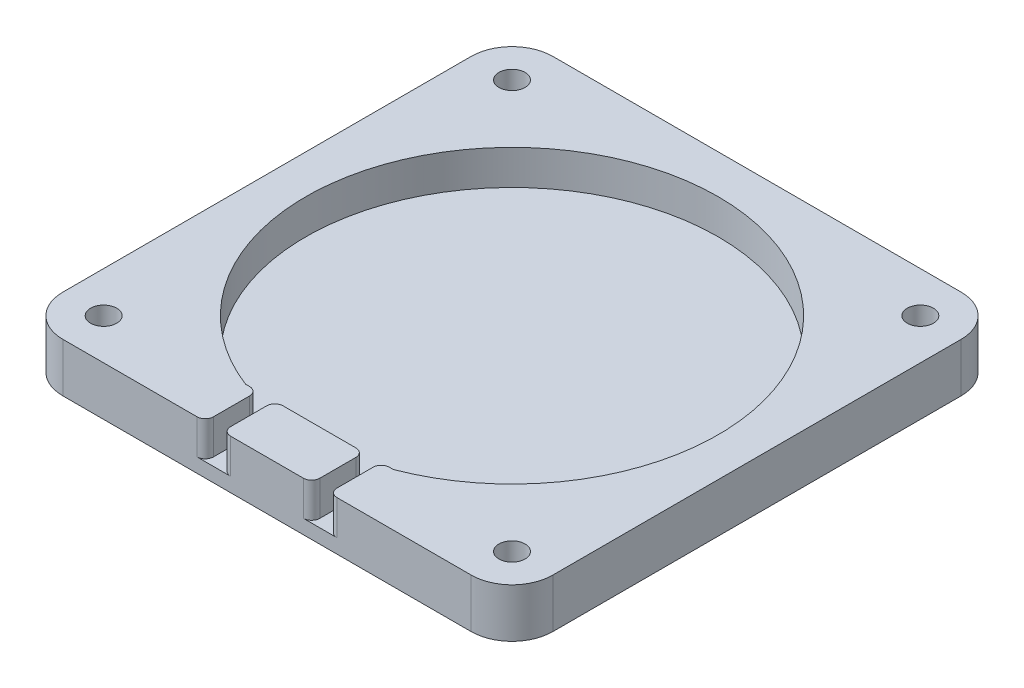
ISO-10303-21;
HEADER;
FILE_DESCRIPTION(('STEP AP214'),'2;1');
FILE_NAME('part.step','',(''),(''),'','','');
FILE_SCHEMA(('AUTOMOTIVE_DESIGN { 1 0 10303 214 1 1 1 1 }'));
ENDSEC;
DATA;
#1=APPLICATION_CONTEXT('core data for automotive mechanical design processes');
#2=APPLICATION_PROTOCOL_DEFINITION('international standard','automotive_design',2000,#1);
#3=PRODUCT_CONTEXT('',#1,'mechanical');
#4=PRODUCT('Part','Part','',(#3));
#5=PRODUCT_RELATED_PRODUCT_CATEGORY('part','',(#4));
#6=PRODUCT_DEFINITION_FORMATION('','',#4);
#7=PRODUCT_DEFINITION_CONTEXT('part definition',#1,'design');
#8=PRODUCT_DEFINITION('design','',#6,#7);
#9=PRODUCT_DEFINITION_SHAPE('','',#8);
#10=(LENGTH_UNIT() NAMED_UNIT(*) SI_UNIT(.MILLI.,.METRE.));
#11=(NAMED_UNIT(*) PLANE_ANGLE_UNIT() SI_UNIT($,.RADIAN.));
#12=(NAMED_UNIT(*) SI_UNIT($,.STERADIAN.) SOLID_ANGLE_UNIT());
#13=UNCERTAINTY_MEASURE_WITH_UNIT(LENGTH_MEASURE(1.E-05),#10,'distance_accuracy_value','');
#14=(GEOMETRIC_REPRESENTATION_CONTEXT(3) GLOBAL_UNCERTAINTY_ASSIGNED_CONTEXT((#13)) GLOBAL_UNIT_ASSIGNED_CONTEXT((#10,
#11,#12)) REPRESENTATION_CONTEXT('',''));
#15=CARTESIAN_POINT('',(0.,0.,0.));
#16=DIRECTION('',(0.,0.,1.));
#17=DIRECTION('',(1.,0.,0.));
#18=AXIS2_PLACEMENT_3D('',#15,#16,#17);
#19=CARTESIAN_POINT('',(0.,-1.74250000000005,0.));
#20=DIRECTION('',(0.,1.,0.));
#21=DIRECTION('',(0.,0.,1.));
#22=AXIS2_PLACEMENT_3D('',#19,#20,#21);
#23=PLANE('',#22);
#24=CARTESIAN_POINT('',(25.,-1.74250000000006,-25.));
#25=DIRECTION('',(0.,-1.,0.));
#26=DIRECTION('',(0.,0.,-1.));
#27=AXIS2_PLACEMENT_3D('',#24,#25,#26);
#28=CIRCLE('',#27,1.59999999999999);
#29=CARTESIAN_POINT('',(25.,-1.74250000000006,-26.6));
#30=VERTEX_POINT('',#29);
#31=EDGE_CURVE('E475',#30,#30,#28,.T.);
#32=ORIENTED_EDGE('',*,*,#31,.F.);
#33=EDGE_LOOP('',(#32));
#34=FACE_BOUND('',#33,.T.);
#35=CARTESIAN_POINT('',(-25.,-1.74250000000006,25.));
#36=DIRECTION('',(0.,-1.,0.));
#37=DIRECTION('',(0.,0.,-1.));
#38=AXIS2_PLACEMENT_3D('',#35,#36,#37);
#39=CIRCLE('',#38,1.59999999999999);
#40=CARTESIAN_POINT('',(-25.,-1.74250000000006,23.4));
#41=VERTEX_POINT('',#40);
#42=EDGE_CURVE('E463',#41,#41,#39,.T.);
#43=ORIENTED_EDGE('',*,*,#42,.F.);
#44=EDGE_LOOP('',(#43));
#45=FACE_BOUND('',#44,.T.);
#46=CARTESIAN_POINT('',(25.,-1.74250000000006,25.));
#47=DIRECTION('',(0.,-1.,0.));
#48=DIRECTION('',(0.,0.,-1.));
#49=AXIS2_PLACEMENT_3D('',#46,#47,#48);
#50=CIRCLE('',#49,1.59999999999999);
#51=CARTESIAN_POINT('',(25.,-1.74250000000006,23.4));
#52=VERTEX_POINT('',#51);
#53=EDGE_CURVE('E454',#52,#52,#50,.T.);
#54=ORIENTED_EDGE('',*,*,#53,.F.);
#55=EDGE_LOOP('',(#54));
#56=FACE_BOUND('',#55,.T.);
#57=DIRECTION('',(0.,0.,1.));
#58=VECTOR('',#57,1.);
#59=CARTESIAN_POINT('',(-30.,-1.74250000000026,30.0000000000006));
#60=LINE('',#59,#58);
#61=CARTESIAN_POINT('',(-30.,-1.74249999999987,-25.));
#62=VERTEX_POINT('',#61);
#63=CARTESIAN_POINT('',(-30.,-1.74250000000022,25.));
#64=VERTEX_POINT('',#63);
#65=EDGE_CURVE('E368',#62,#64,#60,.T.);
#66=ORIENTED_EDGE('',*,*,#65,.F.);
#67=CARTESIAN_POINT('',(-25.,-1.74249999999987,-25.));
#68=DIRECTION('',(0.,1.,0.));
#69=DIRECTION('',(0.,0.,1.));
#70=AXIS2_PLACEMENT_3D('',#67,#68,#69);
#71=CIRCLE('',#70,5.);
#72=CARTESIAN_POINT('',(-25.,-1.74249999999984,-30.));
#73=VERTEX_POINT('',#72);
#74=EDGE_CURVE('E332',#62,#73,#71,.F.);
#75=ORIENTED_EDGE('',*,*,#74,.T.);
#76=DIRECTION('',(-1.,0.,0.));
#77=VECTOR('',#76,1.);
#78=CARTESIAN_POINT('',(-30.,-1.74249999999984,-30.));
#79=LINE('',#78,#77);
#80=CARTESIAN_POINT('',(25.,-1.74249999999984,-30.));
#81=VERTEX_POINT('',#80);
#82=EDGE_CURVE('E363',#81,#73,#79,.T.);
#83=ORIENTED_EDGE('',*,*,#82,.F.);
#84=CARTESIAN_POINT('',(25.,-1.74249999999987,-25.));
#85=DIRECTION('',(0.,1.,0.));
#86=DIRECTION('',(0.,0.,1.));
#87=AXIS2_PLACEMENT_3D('',#84,#85,#86);
#88=CIRCLE('',#87,5.);
#89=CARTESIAN_POINT('',(30.,-1.74249999999988,-25.));
#90=VERTEX_POINT('',#89);
#91=EDGE_CURVE('E328',#81,#90,#88,.F.);
#92=ORIENTED_EDGE('',*,*,#91,.T.);
#93=DIRECTION('',(0.,0.,-1.));
#94=VECTOR('',#93,1.);
#95=CARTESIAN_POINT('',(30.,-1.74249999999984,-29.9999999999994));
#96=LINE('',#95,#94);
#97=CARTESIAN_POINT('',(30.,-1.74250000000023,25.));
#98=VERTEX_POINT('',#97);
#99=EDGE_CURVE('E354',#98,#90,#96,.T.);
#100=ORIENTED_EDGE('',*,*,#99,.F.);
#101=CARTESIAN_POINT('',(25.,-1.74250000000023,25.));
#102=DIRECTION('',(0.,1.,0.));
#103=DIRECTION('',(0.,0.,1.));
#104=AXIS2_PLACEMENT_3D('',#101,#102,#103);
#105=CIRCLE('',#104,5.);
#106=CARTESIAN_POINT('',(25.,-1.74250000000026,30.));
#107=VERTEX_POINT('',#106);
#108=EDGE_CURVE('E326',#98,#107,#105,.F.);
#109=ORIENTED_EDGE('',*,*,#108,.T.);
#110=DIRECTION('',(1.,0.,0.));
#111=VECTOR('',#110,1.);
#112=CARTESIAN_POINT('',(30.,-1.74250000000026,30.));
#113=LINE('',#112,#111);
#114=CARTESIAN_POINT('',(-25.,-1.74250000000026,30.));
#115=VERTEX_POINT('',#114);
#116=EDGE_CURVE('E364',#115,#107,#113,.T.);
#117=ORIENTED_EDGE('',*,*,#116,.F.);
#118=CARTESIAN_POINT('',(-25.,-1.74250000000023,25.));
#119=DIRECTION('',(0.,1.,0.));
#120=DIRECTION('',(0.,0.,1.));
#121=AXIS2_PLACEMENT_3D('',#118,#119,#120);
#122=CIRCLE('',#121,5.);
#123=EDGE_CURVE('E330',#115,#64,#122,.F.);
#124=ORIENTED_EDGE('',*,*,#123,.T.);
#125=EDGE_LOOP('',(#66,#75,#83,#92,#100,#109,#117,#124));
#126=FACE_BOUND('',#125,.T.);
#127=CARTESIAN_POINT('',(-25.,-1.74250000000006,-25.));
#128=DIRECTION('',(0.,-1.,0.));
#129=DIRECTION('',(0.,0.,-1.));
#130=AXIS2_PLACEMENT_3D('',#127,#128,#129);
#131=CIRCLE('',#130,1.59999999999999);
#132=CARTESIAN_POINT('',(-25.,-1.74250000000006,-26.6));
#133=VERTEX_POINT('',#132);
#134=EDGE_CURVE('E469',#133,#133,#131,.T.);
#135=ORIENTED_EDGE('',*,*,#134,.F.);
#136=EDGE_LOOP('',(#135));
#137=FACE_BOUND('',#136,.T.);
#138=ADVANCED_FACE('F42',(#34,#45,#56,#126,#137),#23,.F.);
#139=CARTESIAN_POINT('',(-9.0464410798009,89.1103137423856,23.5738075793812));
#140=DIRECTION('',(0.,0.,-1.));
#141=DIRECTION('',(-1.,0.,0.));
#142=AXIS2_PLACEMENT_3D('',#139,#140,#141);
#143=PLANE('',#142);
#144=DIRECTION('',(1.,0.,0.));
#145=VECTOR('',#144,1.);
#146=CARTESIAN_POINT('',(-9.0464410798009,4.25749999999978,23.5738075793812));
#147=LINE('',#146,#145);
#148=CARTESIAN_POINT('',(-4.46425651660579,4.25749999999978,23.5738075793812));
#149=VERTEX_POINT('',#148);
#150=CARTESIAN_POINT('',(4.46425651660579,4.25749999999978,23.5738075793812));
#151=VERTEX_POINT('',#150);
#152=EDGE_CURVE('E379',#149,#151,#147,.T.);
#153=ORIENTED_EDGE('',*,*,#152,.T.);
#154=DIRECTION('',(0.,1.,0.));
#155=VECTOR('',#154,1.);
#156=CARTESIAN_POINT('',(4.46425651660579,0.,23.5738075793812));
#157=LINE('',#156,#155);
#158=CARTESIAN_POINT('',(4.46425651660579,0.,23.5738075793812));
#159=VERTEX_POINT('',#158);
#160=EDGE_CURVE('E290',#151,#159,#157,.F.);
#161=ORIENTED_EDGE('',*,*,#160,.T.);
#162=DIRECTION('',(1.,0.,0.));
#163=VECTOR('',#162,1.);
#164=CARTESIAN_POINT('',(-9.0464410798009,0.,23.5738075793812));
#165=LINE('',#164,#163);
#166=CARTESIAN_POINT('',(-4.46425651660579,0.,23.5738075793812));
#167=VERTEX_POINT('',#166);
#168=EDGE_CURVE('E226',#167,#159,#165,.T.);
#169=ORIENTED_EDGE('',*,*,#168,.F.);
#170=DIRECTION('',(0.,-1.,0.));
#171=VECTOR('',#170,1.);
#172=CARTESIAN_POINT('',(-4.46425651660579,4.25749999999978,23.5738075793812));
#173=LINE('',#172,#171);
#174=EDGE_CURVE('E288',#167,#149,#173,.F.);
#175=ORIENTED_EDGE('',*,*,#174,.T.);
#176=EDGE_LOOP('',(#153,#161,#169,#175));
#177=FACE_BOUND('',#176,.T.);
#178=ADVANCED_FACE('F483',(#177),#143,.T.);
#179=CARTESIAN_POINT('',(-9.0464410798009,4.25749999999976,23.5738075793812));
#180=VERTEX_POINT('',#179);
#181=CARTESIAN_POINT('',(-8.55999999999981,4.25749999999978,23.5738075793812));
#182=VERTEX_POINT('',#181);
#183=EDGE_CURVE('E375',#180,#182,#147,.T.);
#184=ORIENTED_EDGE('',*,*,#183,.T.);
#185=DIRECTION('',(0.,1.,0.));
#186=VECTOR('',#185,1.);
#187=CARTESIAN_POINT('',(-8.55999999999981,0.,23.5738075793812));
#188=LINE('',#187,#186);
#189=CARTESIAN_POINT('',(-8.55999999999981,0.,23.5738075793812));
#190=VERTEX_POINT('',#189);
#191=EDGE_CURVE('E302',#182,#190,#188,.F.);
#192=ORIENTED_EDGE('',*,*,#191,.T.);
#193=CARTESIAN_POINT('',(-9.0464410798009,0.,23.5738075793812));
#194=VERTEX_POINT('',#193);
#195=EDGE_CURVE('E229',#194,#190,#165,.T.);
#196=ORIENTED_EDGE('',*,*,#195,.F.);
#197=DIRECTION('',(0.,-1.,0.));
#198=VECTOR('',#197,1.);
#199=CARTESIAN_POINT('',(-9.0464410798009,89.1103137423856,23.5738075793812));
#200=LINE('',#199,#198);
#201=EDGE_CURVE('E236',#180,#194,#200,.T.);
#202=ORIENTED_EDGE('',*,*,#201,.F.);
#203=EDGE_LOOP('',(#184,#192,#196,#202));
#204=FACE_BOUND('',#203,.T.);
#205=ADVANCED_FACE('F526',(#204),#143,.T.);
#206=CARTESIAN_POINT('',(0.,4.25749999999995,0.));
#207=DIRECTION('',(0.,1.,0.));
#208=DIRECTION('',(0.,0.,1.));
#209=AXIS2_PLACEMENT_3D('',#206,#207,#208);
#210=PLANE('',#209);
#211=DIRECTION('',(1.,0.,0.));
#212=VECTOR('',#211,1.);
#213=CARTESIAN_POINT('',(-30.,4.25749999999973,30.));
#214=LINE('',#213,#212);
#215=CARTESIAN_POINT('',(-4.46425651660579,4.25749999999973,30.));
#216=VERTEX_POINT('',#215);
#217=CARTESIAN_POINT('',(4.46425651660579,4.25749999999973,30.));
#218=VERTEX_POINT('',#217);
#219=EDGE_CURVE('E383',#216,#218,#214,.T.);
#220=ORIENTED_EDGE('',*,*,#219,.T.);
#221=CARTESIAN_POINT('',(4.46425651660579,4.25749999999973,29.));
#222=DIRECTION('',(0.,1.,0.));
#223=DIRECTION('',(0.,0.,1.));
#224=AXIS2_PLACEMENT_3D('',#221,#222,#223);
#225=CIRCLE('',#224,1.);
#226=CARTESIAN_POINT('',(5.46425651660579,4.25749999999974,29.));
#227=VERTEX_POINT('',#226);
#228=EDGE_CURVE('E279',#218,#227,#225,.T.);
#229=ORIENTED_EDGE('',*,*,#228,.T.);
#230=DIRECTION('',(0.,0.,1.));
#231=VECTOR('',#230,1.);
#232=CARTESIAN_POINT('',(5.46425651660579,4.25749999999962,46.4548250881965));
#233=LINE('',#232,#231);
#234=CARTESIAN_POINT('',(5.46425651660579,4.25749999999977,24.5738075793812));
#235=VERTEX_POINT('',#234);
#236=EDGE_CURVE('E405',#235,#227,#233,.T.);
#237=ORIENTED_EDGE('',*,*,#236,.F.);
#238=CARTESIAN_POINT('',(4.46425651660579,4.25749999999978,24.5738075793812));
#239=DIRECTION('',(0.,1.,0.));
#240=DIRECTION('',(0.,0.,1.));
#241=AXIS2_PLACEMENT_3D('',#238,#239,#240);
#242=CIRCLE('',#241,1.);
#243=EDGE_CURVE('E277',#235,#151,#242,.T.);
#244=ORIENTED_EDGE('',*,*,#243,.T.);
#245=ORIENTED_EDGE('',*,*,#152,.F.);
#246=CARTESIAN_POINT('',(-4.46425651660579,4.25749999999978,24.5738075793812));
#247=DIRECTION('',(0.,1.,0.));
#248=DIRECTION('',(0.,0.,1.));
#249=AXIS2_PLACEMENT_3D('',#246,#247,#248);
#250=CIRCLE('',#249,1.);
#251=CARTESIAN_POINT('',(-5.46425651660579,4.25749999999977,24.5738075793812));
#252=VERTEX_POINT('',#251);
#253=EDGE_CURVE('E275',#149,#252,#250,.T.);
#254=ORIENTED_EDGE('',*,*,#253,.T.);
#255=DIRECTION('',(0.,0.,-1.));
#256=VECTOR('',#255,1.);
#257=CARTESIAN_POINT('',(-5.46425651660579,4.25749999999962,46.4548250881965));
#258=LINE('',#257,#256);
#259=CARTESIAN_POINT('',(-5.46425651660579,4.25749999999974,29.));
#260=VERTEX_POINT('',#259);
#261=EDGE_CURVE('E443',#260,#252,#258,.T.);
#262=ORIENTED_EDGE('',*,*,#261,.F.);
#263=CARTESIAN_POINT('',(-4.46425651660579,4.25749999999973,29.));
#264=DIRECTION('',(0.,1.,0.));
#265=DIRECTION('',(0.,0.,1.));
#266=AXIS2_PLACEMENT_3D('',#263,#264,#265);
#267=CIRCLE('',#266,1.);
#268=EDGE_CURVE('E273',#260,#216,#267,.T.);
#269=ORIENTED_EDGE('',*,*,#268,.T.);
#270=EDGE_LOOP('',(#220,#229,#237,#244,#245,#254,#262,#269));
#271=FACE_BOUND('',#270,.T.);
#272=ADVANCED_FACE('F410',(#271),#210,.T.);
#273=CARTESIAN_POINT('',(-30.,89.1103137423856,30.));
#274=DIRECTION('',(0.,0.,-1.));
#275=DIRECTION('',(-1.,0.,0.));
#276=AXIS2_PLACEMENT_3D('',#273,#274,#275);
#277=PLANE('',#276);
#278=CARTESIAN_POINT('',(-25.,4.25749999999973,30.));
#279=VERTEX_POINT('',#278);
#280=CARTESIAN_POINT('',(-8.55999999999981,4.25749999999973,30.));
#281=VERTEX_POINT('',#280);
#282=EDGE_CURVE('E380',#279,#281,#214,.T.);
#283=ORIENTED_EDGE('',*,*,#282,.F.);
#284=DIRECTION('',(0.,-1.,0.));
#285=VECTOR('',#284,1.);
#286=CARTESIAN_POINT('',(-25.,89.1103137423856,30.));
#287=LINE('',#286,#285);
#288=EDGE_CURVE('E348',#279,#115,#287,.T.);
#289=ORIENTED_EDGE('',*,*,#288,.T.);
#290=ORIENTED_EDGE('',*,*,#116,.T.);
#291=DIRECTION('',(0.,-1.,0.));
#292=VECTOR('',#291,1.);
#293=CARTESIAN_POINT('',(25.,89.1103137423856,30.));
#294=LINE('',#293,#292);
#295=CARTESIAN_POINT('',(25.,4.25749999999973,30.));
#296=VERTEX_POINT('',#295);
#297=EDGE_CURVE('E346',#107,#296,#294,.F.);
#298=ORIENTED_EDGE('',*,*,#297,.T.);
#299=CARTESIAN_POINT('',(8.55999999999982,4.25749999999973,30.));
#300=VERTEX_POINT('',#299);
#301=EDGE_CURVE('E378',#300,#296,#214,.T.);
#302=ORIENTED_EDGE('',*,*,#301,.F.);
#303=DIRECTION('',(0.,-1.,0.));
#304=VECTOR('',#303,1.);
#305=CARTESIAN_POINT('',(8.55999999999982,89.1103137423856,30.));
#306=LINE('',#305,#304);
#307=CARTESIAN_POINT('',(8.55999999999982,0.,30.));
#308=VERTEX_POINT('',#307);
#309=EDGE_CURVE('E257',#300,#308,#306,.T.);
#310=ORIENTED_EDGE('',*,*,#309,.T.);
#311=DIRECTION('',(-1.,0.,0.));
#312=VECTOR('',#311,1.);
#313=CARTESIAN_POINT('',(-30.,0.,30.));
#314=LINE('',#313,#312);
#315=CARTESIAN_POINT('',(4.46425651660579,0.,30.));
#316=VERTEX_POINT('',#315);
#317=EDGE_CURVE('E422',#308,#316,#314,.T.);
#318=ORIENTED_EDGE('',*,*,#317,.T.);
#319=DIRECTION('',(0.,1.,0.));
#320=VECTOR('',#319,1.);
#321=CARTESIAN_POINT('',(4.46425651660579,89.1103137423856,30.));
#322=LINE('',#321,#320);
#323=EDGE_CURVE('E254',#316,#218,#322,.T.);
#324=ORIENTED_EDGE('',*,*,#323,.T.);
#325=ORIENTED_EDGE('',*,*,#219,.F.);
#326=DIRECTION('',(0.,-1.,0.));
#327=VECTOR('',#326,1.);
#328=CARTESIAN_POINT('',(-4.46425651660579,89.1103137423856,30.));
#329=LINE('',#328,#327);
#330=CARTESIAN_POINT('',(-4.46425651660579,0.,30.));
#331=VERTEX_POINT('',#330);
#332=EDGE_CURVE('E251',#216,#331,#329,.T.);
#333=ORIENTED_EDGE('',*,*,#332,.T.);
#334=DIRECTION('',(-1.,0.,0.));
#335=VECTOR('',#334,1.);
#336=CARTESIAN_POINT('',(-30.,0.,30.));
#337=LINE('',#336,#335);
#338=CARTESIAN_POINT('',(-8.55999999999981,0.,30.));
#339=VERTEX_POINT('',#338);
#340=EDGE_CURVE('E374',#331,#339,#337,.T.);
#341=ORIENTED_EDGE('',*,*,#340,.T.);
#342=DIRECTION('',(0.,1.,0.));
#343=VECTOR('',#342,1.);
#344=CARTESIAN_POINT('',(-8.55999999999981,89.1103137423856,30.));
#345=LINE('',#344,#343);
#346=EDGE_CURVE('E248',#339,#281,#345,.T.);
#347=ORIENTED_EDGE('',*,*,#346,.T.);
#348=EDGE_LOOP('',(#283,#289,#290,#298,#302,#310,#318,#324,#325,#333,#341,#347));
#349=FACE_BOUND('',#348,.T.);
#350=ADVANCED_FACE('F425',(#349),#277,.F.);
#351=CARTESIAN_POINT('',(-30.,89.1103137423856,30.));
#352=DIRECTION('',(1.,0.,0.));
#353=DIRECTION('',(0.,0.,-1.));
#354=AXIS2_PLACEMENT_3D('',#351,#352,#353);
#355=PLANE('',#354);
#356=DIRECTION('',(0.,0.,1.));
#357=VECTOR('',#356,1.);
#358=CARTESIAN_POINT('',(-30.,4.25749999999973,29.9999999999994));
#359=LINE('',#358,#357);
#360=CARTESIAN_POINT('',(-30.,4.25750000000012,-25.));
#361=VERTEX_POINT('',#360);
#362=CARTESIAN_POINT('',(-30.,4.25749999999977,25.));
#363=VERTEX_POINT('',#362);
#364=EDGE_CURVE('E382',#361,#363,#359,.T.);
#365=ORIENTED_EDGE('',*,*,#364,.F.);
#366=DIRECTION('',(0.,-1.,0.));
#367=VECTOR('',#366,1.);
#368=CARTESIAN_POINT('',(-30.,89.1103137423856,-25.));
#369=LINE('',#368,#367);
#370=EDGE_CURVE('E323',#361,#62,#369,.T.);
#371=ORIENTED_EDGE('',*,*,#370,.T.);
#372=ORIENTED_EDGE('',*,*,#65,.T.);
#373=DIRECTION('',(0.,-1.,0.));
#374=VECTOR('',#373,1.);
#375=CARTESIAN_POINT('',(-30.,89.1103137423856,25.));
#376=LINE('',#375,#374);
#377=EDGE_CURVE('E321',#64,#363,#376,.F.);
#378=ORIENTED_EDGE('',*,*,#377,.T.);
#379=EDGE_LOOP('',(#365,#371,#372,#378));
#380=FACE_BOUND('',#379,.T.);
#381=ADVANCED_FACE('F529',(#380),#355,.F.);
#382=CARTESIAN_POINT('',(-30.,89.1103137423856,-30.));
#383=DIRECTION('',(0.,0.,1.));
#384=DIRECTION('',(1.,0.,0.));
#385=AXIS2_PLACEMENT_3D('',#382,#383,#384);
#386=PLANE('',#385);
#387=ORIENTED_EDGE('',*,*,#82,.T.);
#388=DIRECTION('',(0.,-1.,0.));
#389=VECTOR('',#388,1.);
#390=CARTESIAN_POINT('',(-25.,89.1103137423856,-30.));
#391=LINE('',#390,#389);
#392=CARTESIAN_POINT('',(-25.,4.25750000000015,-30.));
#393=VERTEX_POINT('',#392);
#394=EDGE_CURVE('E337',#73,#393,#391,.F.);
#395=ORIENTED_EDGE('',*,*,#394,.T.);
#396=DIRECTION('',(-1.,0.,0.));
#397=VECTOR('',#396,1.);
#398=CARTESIAN_POINT('',(-30.,4.25750000000015,-30.));
#399=LINE('',#398,#397);
#400=CARTESIAN_POINT('',(25.,4.25750000000015,-30.));
#401=VERTEX_POINT('',#400);
#402=EDGE_CURVE('E385',#401,#393,#399,.T.);
#403=ORIENTED_EDGE('',*,*,#402,.F.);
#404=DIRECTION('',(0.,-1.,0.));
#405=VECTOR('',#404,1.);
#406=CARTESIAN_POINT('',(25.,89.1103137423856,-30.));
#407=LINE('',#406,#405);
#408=EDGE_CURVE('E334',#401,#81,#407,.T.);
#409=ORIENTED_EDGE('',*,*,#408,.T.);
#410=EDGE_LOOP('',(#387,#395,#403,#409));
#411=FACE_BOUND('',#410,.T.);
#412=ADVANCED_FACE('F532',(#411),#386,.F.);
#413=CARTESIAN_POINT('',(30.,89.1103137423856,30.));
#414=DIRECTION('',(-1.,0.,0.));
#415=DIRECTION('',(0.,0.,1.));
#416=AXIS2_PLACEMENT_3D('',#413,#414,#415);
#417=PLANE('',#416);
#418=ORIENTED_EDGE('',*,*,#99,.T.);
#419=DIRECTION('',(0.,-1.,0.));
#420=VECTOR('',#419,1.);
#421=CARTESIAN_POINT('',(30.,89.1103137423856,-25.));
#422=LINE('',#421,#420);
#423=CARTESIAN_POINT('',(30.,4.25750000000012,-25.));
#424=VERTEX_POINT('',#423);
#425=EDGE_CURVE('E12',#90,#424,#422,.F.);
#426=ORIENTED_EDGE('',*,*,#425,.T.);
#427=DIRECTION('',(0.,0.,-1.));
#428=VECTOR('',#427,1.);
#429=CARTESIAN_POINT('',(30.,4.25749999999973,29.9999999999994));
#430=LINE('',#429,#428);
#431=CARTESIAN_POINT('',(30.,4.25749999999977,25.));
#432=VERTEX_POINT('',#431);
#433=EDGE_CURVE('E227',#432,#424,#430,.T.);
#434=ORIENTED_EDGE('',*,*,#433,.F.);
#435=DIRECTION('',(0.,-1.,0.));
#436=VECTOR('',#435,1.);
#437=CARTESIAN_POINT('',(30.,89.1103137423856,25.));
#438=LINE('',#437,#436);
#439=EDGE_CURVE('E50',#432,#98,#438,.T.);
#440=ORIENTED_EDGE('',*,*,#439,.T.);
#441=EDGE_LOOP('',(#418,#426,#434,#440));
#442=FACE_BOUND('',#441,.T.);
#443=ADVANCED_FACE('F353',(#442),#417,.F.);
#444=CARTESIAN_POINT('',(0.,89.1103137423856,0.));
#445=DIRECTION('',(0.,-1.,0.));
#446=DIRECTION('',(0.,0.,-1.));
#447=AXIS2_PLACEMENT_3D('',#444,#445,#446);
#448=CYLINDRICAL_SURFACE('',#447,25.25);
#449=DIRECTION('',(0.,-1.,0.));
#450=VECTOR('',#449,1.);
#451=CARTESIAN_POINT('',(9.0464410798009,89.1103137423856,23.5738075793812));
#452=LINE('',#451,#450);
#453=CARTESIAN_POINT('',(9.0464410798009,4.25749999999978,23.5738075793812));
#454=VERTEX_POINT('',#453);
#455=CARTESIAN_POINT('',(9.0464410798009,0.,23.5738075793812));
#456=VERTEX_POINT('',#455);
#457=EDGE_CURVE('E234',#454,#456,#452,.T.);
#458=ORIENTED_EDGE('',*,*,#457,.F.);
#459=CARTESIAN_POINT('',(0.,4.25749999999994,0.));
#460=DIRECTION('',(0.,1.,0.));
#461=DIRECTION('',(0.,0.,1.));
#462=AXIS2_PLACEMENT_3D('',#459,#460,#461);
#463=CIRCLE('',#462,25.25);
#464=EDGE_CURVE('E244',#454,#180,#463,.T.);
#465=ORIENTED_EDGE('',*,*,#464,.T.);
#466=ORIENTED_EDGE('',*,*,#201,.T.);
#467=CARTESIAN_POINT('',(0.,0.,0.));
#468=DIRECTION('',(0.,1.,0.));
#469=DIRECTION('',(0.,0.,1.));
#470=AXIS2_PLACEMENT_3D('',#467,#468,#469);
#471=CIRCLE('',#470,25.25);
#472=EDGE_CURVE('E220',#456,#194,#471,.T.);
#473=ORIENTED_EDGE('',*,*,#472,.F.);
#474=EDGE_LOOP('',(#458,#465,#466,#473));
#475=FACE_BOUND('',#474,.T.);
#476=ADVANCED_FACE('F232',(#475),#448,.F.);
#477=CARTESIAN_POINT('',(8.55999999999981,0.,23.5738075793812));
#478=VERTEX_POINT('',#477);
#479=EDGE_CURVE('E216',#478,#456,#165,.T.);
#480=ORIENTED_EDGE('',*,*,#479,.F.);
#481=DIRECTION('',(0.,-1.,0.));
#482=VECTOR('',#481,1.);
#483=CARTESIAN_POINT('',(8.55999999999981,4.25749999999978,23.5738075793812));
#484=LINE('',#483,#482);
#485=CARTESIAN_POINT('',(8.55999999999981,4.25749999999978,23.5738075793812));
#486=VERTEX_POINT('',#485);
#487=EDGE_CURVE('E286',#478,#486,#484,.F.);
#488=ORIENTED_EDGE('',*,*,#487,.T.);
#489=EDGE_CURVE('E241',#486,#454,#147,.T.);
#490=ORIENTED_EDGE('',*,*,#489,.T.);
#491=ORIENTED_EDGE('',*,*,#457,.T.);
#492=EDGE_LOOP('',(#480,#488,#490,#491));
#493=FACE_BOUND('',#492,.T.);
#494=ADVANCED_FACE('F239',(#493),#143,.T.);
#495=CARTESIAN_POINT('',(25.,4.25750000000015,-25.));
#496=DIRECTION('',(0.,-1.,0.));
#497=DIRECTION('',(0.,0.,-1.));
#498=AXIS2_PLACEMENT_3D('',#495,#496,#497);
#499=CIRCLE('',#498,1.6);
#500=CARTESIAN_POINT('',(25.,4.25750000000015,-26.6));
#501=VERTEX_POINT('',#500);
#502=EDGE_CURVE('E472',#501,#501,#499,.T.);
#503=ORIENTED_EDGE('',*,*,#502,.T.);
#504=EDGE_LOOP('',(#503));
#505=FACE_BOUND('',#504,.T.);
#506=CARTESIAN_POINT('',(-25.,4.25750000000015,-25.));
#507=DIRECTION('',(0.,-1.,0.));
#508=DIRECTION('',(0.,0.,-1.));
#509=AXIS2_PLACEMENT_3D('',#506,#507,#508);
#510=CIRCLE('',#509,1.6);
#511=CARTESIAN_POINT('',(-25.,4.25750000000015,-26.6));
#512=VERTEX_POINT('',#511);
#513=EDGE_CURVE('E466',#512,#512,#510,.T.);
#514=ORIENTED_EDGE('',*,*,#513,.T.);
#515=EDGE_LOOP('',(#514));
#516=FACE_BOUND('',#515,.T.);
#517=CARTESIAN_POINT('',(-25.,4.25750000000015,25.));
#518=DIRECTION('',(0.,-1.,0.));
#519=DIRECTION('',(0.,0.,-1.));
#520=AXIS2_PLACEMENT_3D('',#517,#518,#519);
#521=CIRCLE('',#520,1.6);
#522=CARTESIAN_POINT('',(-25.,4.25750000000015,23.4));
#523=VERTEX_POINT('',#522);
#524=EDGE_CURVE('E458',#523,#523,#521,.T.);
#525=ORIENTED_EDGE('',*,*,#524,.T.);
#526=EDGE_LOOP('',(#525));
#527=FACE_BOUND('',#526,.T.);
#528=CARTESIAN_POINT('',(25.,4.25750000000015,25.));
#529=DIRECTION('',(0.,-1.,0.));
#530=DIRECTION('',(0.,0.,-1.));
#531=AXIS2_PLACEMENT_3D('',#528,#529,#530);
#532=CIRCLE('',#531,1.6);
#533=CARTESIAN_POINT('',(25.,4.25750000000015,23.4));
#534=VERTEX_POINT('',#533);
#535=EDGE_CURVE('E451',#534,#534,#532,.T.);
#536=ORIENTED_EDGE('',*,*,#535,.T.);
#537=EDGE_LOOP('',(#536));
#538=FACE_BOUND('',#537,.T.);
#539=ORIENTED_EDGE('',*,*,#402,.T.);
#540=CARTESIAN_POINT('',(-25.,4.25750000000012,-25.));
#541=DIRECTION('',(0.,1.,0.));
#542=DIRECTION('',(0.,0.,1.));
#543=AXIS2_PLACEMENT_3D('',#540,#541,#542);
#544=CIRCLE('',#543,5.);
#545=EDGE_CURVE('E344',#393,#361,#544,.T.);
#546=ORIENTED_EDGE('',*,*,#545,.T.);
#547=ORIENTED_EDGE('',*,*,#364,.T.);
#548=CARTESIAN_POINT('',(-25.,4.25749999999976,25.));
#549=DIRECTION('',(0.,1.,0.));
#550=DIRECTION('',(0.,0.,1.));
#551=AXIS2_PLACEMENT_3D('',#548,#549,#550);
#552=CIRCLE('',#551,5.);
#553=EDGE_CURVE('E57',#363,#279,#552,.T.);
#554=ORIENTED_EDGE('',*,*,#553,.T.);
#555=ORIENTED_EDGE('',*,*,#282,.T.);
#556=CARTESIAN_POINT('',(-8.55999999999981,4.25749999999973,29.));
#557=DIRECTION('',(0.,1.,0.));
#558=DIRECTION('',(0.,0.,1.));
#559=AXIS2_PLACEMENT_3D('',#556,#557,#558);
#560=CIRCLE('',#559,1.);
#561=CARTESIAN_POINT('',(-7.55999999999981,4.25749999999974,29.));
#562=VERTEX_POINT('',#561);
#563=EDGE_CURVE('E265',#281,#562,#560,.T.);
#564=ORIENTED_EDGE('',*,*,#563,.T.);
#565=DIRECTION('',(0.,0.,1.));
#566=VECTOR('',#565,1.);
#567=CARTESIAN_POINT('',(-7.55999999999981,4.25749999999962,46.4548250881965));
#568=LINE('',#567,#566);
#569=CARTESIAN_POINT('',(-7.55999999999981,4.25749999999977,24.5738075793812));
#570=VERTEX_POINT('',#569);
#571=EDGE_CURVE('E416',#570,#562,#568,.T.);
#572=ORIENTED_EDGE('',*,*,#571,.F.);
#573=CARTESIAN_POINT('',(-8.55999999999981,4.25749999999978,24.5738075793812));
#574=DIRECTION('',(0.,1.,0.));
#575=DIRECTION('',(0.,0.,1.));
#576=AXIS2_PLACEMENT_3D('',#573,#574,#575);
#577=CIRCLE('',#576,1.);
#578=EDGE_CURVE('E267',#570,#182,#577,.T.);
#579=ORIENTED_EDGE('',*,*,#578,.T.);
#580=ORIENTED_EDGE('',*,*,#183,.F.);
#581=ORIENTED_EDGE('',*,*,#464,.F.);
#582=ORIENTED_EDGE('',*,*,#489,.F.);
#583=CARTESIAN_POINT('',(8.55999999999981,4.25749999999978,24.5738075793812));
#584=DIRECTION('',(0.,1.,0.));
#585=DIRECTION('',(0.,0.,1.));
#586=AXIS2_PLACEMENT_3D('',#583,#584,#585);
#587=CIRCLE('',#586,1.);
#588=CARTESIAN_POINT('',(7.55999999999981,4.25749999999977,24.5738075793812));
#589=VERTEX_POINT('',#588);
#590=EDGE_CURVE('E269',#486,#589,#587,.T.);
#591=ORIENTED_EDGE('',*,*,#590,.T.);
#592=DIRECTION('',(0.,0.,-1.));
#593=VECTOR('',#592,1.);
#594=CARTESIAN_POINT('',(7.55999999999981,4.25749999999962,46.4548250881965));
#595=LINE('',#594,#593);
#596=CARTESIAN_POINT('',(7.55999999999981,4.25749999999974,29.));
#597=VERTEX_POINT('',#596);
#598=EDGE_CURVE('E413',#597,#589,#595,.T.);
#599=ORIENTED_EDGE('',*,*,#598,.F.);
#600=CARTESIAN_POINT('',(8.55999999999982,4.25749999999973,29.));
#601=DIRECTION('',(0.,1.,0.));
#602=DIRECTION('',(0.,0.,1.));
#603=AXIS2_PLACEMENT_3D('',#600,#601,#602);
#604=CIRCLE('',#603,1.);
#605=EDGE_CURVE('E271',#597,#300,#604,.T.);
#606=ORIENTED_EDGE('',*,*,#605,.T.);
#607=ORIENTED_EDGE('',*,*,#301,.T.);
#608=CARTESIAN_POINT('',(25.,4.25749999999976,25.));
#609=DIRECTION('',(0.,1.,0.));
#610=DIRECTION('',(0.,0.,1.));
#611=AXIS2_PLACEMENT_3D('',#608,#609,#610);
#612=CIRCLE('',#611,5.);
#613=EDGE_CURVE('E339',#296,#432,#612,.T.);
#614=ORIENTED_EDGE('',*,*,#613,.T.);
#615=ORIENTED_EDGE('',*,*,#433,.T.);
#616=CARTESIAN_POINT('',(25.,4.25750000000012,-25.));
#617=DIRECTION('',(0.,1.,0.));
#618=DIRECTION('',(0.,0.,1.));
#619=AXIS2_PLACEMENT_3D('',#616,#617,#618);
#620=CIRCLE('',#619,5.);
#621=EDGE_CURVE('E341',#424,#401,#620,.T.);
#622=ORIENTED_EDGE('',*,*,#621,.T.);
#623=EDGE_LOOP('',(#539,#546,#547,#554,#555,#564,#572,#579,#580,#581,#582,#591,#599,#606,#607,
#614,#615,#622));
#624=FACE_BOUND('',#623,.T.);
#625=ADVANCED_FACE('F439',(#505,#516,#527,#538,#624),#210,.T.);
#626=CARTESIAN_POINT('',(0.,0.,0.));
#627=DIRECTION('',(0.,-1.,0.));
#628=DIRECTION('',(0.,0.,-1.));
#629=AXIS2_PLACEMENT_3D('',#626,#627,#628);
#630=PLANE('',#629);
#631=ORIENTED_EDGE('',*,*,#195,.T.);
#632=CARTESIAN_POINT('',(-8.55999999999981,0.,24.5738075793812));
#633=DIRECTION('',(0.,-1.,0.));
#634=DIRECTION('',(0.,0.,-1.));
#635=AXIS2_PLACEMENT_3D('',#632,#633,#634);
#636=CIRCLE('',#635,1.);
#637=CARTESIAN_POINT('',(-7.55999999999981,0.,24.5738075793812));
#638=VERTEX_POINT('',#637);
#639=EDGE_CURVE('E314',#190,#638,#636,.T.);
#640=ORIENTED_EDGE('',*,*,#639,.T.);
#641=DIRECTION('',(0.,0.,1.));
#642=VECTOR('',#641,1.);
#643=CARTESIAN_POINT('',(-7.55999999999981,0.,46.4548250881963));
#644=LINE('',#643,#642);
#645=CARTESIAN_POINT('',(-7.55999999999981,0.,29.));
#646=VERTEX_POINT('',#645);
#647=EDGE_CURVE('E423',#638,#646,#644,.T.);
#648=ORIENTED_EDGE('',*,*,#647,.T.);
#649=CARTESIAN_POINT('',(-8.55999999999981,0.,29.));
#650=DIRECTION('',(0.,-1.,0.));
#651=DIRECTION('',(0.,0.,-1.));
#652=AXIS2_PLACEMENT_3D('',#649,#650,#651);
#653=CIRCLE('',#652,1.);
#654=EDGE_CURVE('E318',#646,#339,#653,.T.);
#655=ORIENTED_EDGE('',*,*,#654,.T.);
#656=ORIENTED_EDGE('',*,*,#340,.F.);
#657=CARTESIAN_POINT('',(-4.46425651660579,0.,29.));
#658=DIRECTION('',(0.,-1.,0.));
#659=DIRECTION('',(0.,0.,-1.));
#660=AXIS2_PLACEMENT_3D('',#657,#658,#659);
#661=CIRCLE('',#660,1.);
#662=CARTESIAN_POINT('',(-5.46425651660579,0.,29.));
#663=VERTEX_POINT('',#662);
#664=EDGE_CURVE('E316',#331,#663,#661,.T.);
#665=ORIENTED_EDGE('',*,*,#664,.T.);
#666=DIRECTION('',(0.,0.,-1.));
#667=VECTOR('',#666,1.);
#668=CARTESIAN_POINT('',(-5.46425651660579,0.,46.4548250881963));
#669=LINE('',#668,#667);
#670=CARTESIAN_POINT('',(-5.46425651660579,0.,24.5738075793812));
#671=VERTEX_POINT('',#670);
#672=EDGE_CURVE('E446',#663,#671,#669,.T.);
#673=ORIENTED_EDGE('',*,*,#672,.T.);
#674=CARTESIAN_POINT('',(-4.46425651660579,0.,24.5738075793812));
#675=DIRECTION('',(0.,-1.,0.));
#676=DIRECTION('',(0.,0.,-1.));
#677=AXIS2_PLACEMENT_3D('',#674,#675,#676);
#678=CIRCLE('',#677,1.);
#679=EDGE_CURVE('E312',#671,#167,#678,.T.);
#680=ORIENTED_EDGE('',*,*,#679,.T.);
#681=ORIENTED_EDGE('',*,*,#168,.T.);
#682=CARTESIAN_POINT('',(4.46425651660579,0.,24.5738075793812));
#683=DIRECTION('',(0.,-1.,0.));
#684=DIRECTION('',(0.,0.,-1.));
#685=AXIS2_PLACEMENT_3D('',#682,#683,#684);
#686=CIRCLE('',#685,1.);
#687=CARTESIAN_POINT('',(5.46425651660579,0.,24.5738075793812));
#688=VERTEX_POINT('',#687);
#689=EDGE_CURVE('E310',#159,#688,#686,.T.);
#690=ORIENTED_EDGE('',*,*,#689,.T.);
#691=DIRECTION('',(0.,0.,1.));
#692=VECTOR('',#691,1.);
#693=CARTESIAN_POINT('',(5.46425651660579,0.,46.4548250881963));
#694=LINE('',#693,#692);
#695=CARTESIAN_POINT('',(5.46425651660579,0.,29.));
#696=VERTEX_POINT('',#695);
#697=EDGE_CURVE('E407',#688,#696,#694,.T.);
#698=ORIENTED_EDGE('',*,*,#697,.T.);
#699=CARTESIAN_POINT('',(4.46425651660579,0.,29.));
#700=DIRECTION('',(0.,-1.,0.));
#701=DIRECTION('',(0.,0.,-1.));
#702=AXIS2_PLACEMENT_3D('',#699,#700,#701);
#703=CIRCLE('',#702,1.);
#704=EDGE_CURVE('E306',#696,#316,#703,.T.);
#705=ORIENTED_EDGE('',*,*,#704,.T.);
#706=ORIENTED_EDGE('',*,*,#317,.F.);
#707=CARTESIAN_POINT('',(8.55999999999982,0.,29.));
#708=DIRECTION('',(0.,-1.,0.));
#709=DIRECTION('',(0.,0.,-1.));
#710=AXIS2_PLACEMENT_3D('',#707,#708,#709);
#711=CIRCLE('',#710,1.);
#712=CARTESIAN_POINT('',(7.55999999999981,0.,29.));
#713=VERTEX_POINT('',#712);
#714=EDGE_CURVE('E304',#308,#713,#711,.T.);
#715=ORIENTED_EDGE('',*,*,#714,.T.);
#716=DIRECTION('',(0.,0.,-1.));
#717=VECTOR('',#716,1.);
#718=CARTESIAN_POINT('',(7.55999999999981,0.,46.4548250881963));
#719=LINE('',#718,#717);
#720=CARTESIAN_POINT('',(7.55999999999981,0.,24.5738075793812));
#721=VERTEX_POINT('',#720);
#722=EDGE_CURVE('E418',#713,#721,#719,.T.);
#723=ORIENTED_EDGE('',*,*,#722,.T.);
#724=CARTESIAN_POINT('',(8.55999999999981,0.,24.5738075793812));
#725=DIRECTION('',(0.,-1.,0.));
#726=DIRECTION('',(0.,0.,-1.));
#727=AXIS2_PLACEMENT_3D('',#724,#725,#726);
#728=CIRCLE('',#727,1.);
#729=EDGE_CURVE('E222',#721,#478,#728,.T.);
#730=ORIENTED_EDGE('',*,*,#729,.T.);
#731=ORIENTED_EDGE('',*,*,#479,.T.);
#732=ORIENTED_EDGE('',*,*,#472,.T.);
#733=EDGE_LOOP('',(#631,#640,#648,#655,#656,#665,#673,#680,#681,#690,#698,#705,#706,#715,#723,
#730,#731,#732));
#734=FACE_BOUND('',#733,.T.);
#735=ADVANCED_FACE('F219',(#734),#630,.F.);
#736=CARTESIAN_POINT('',(5.46425651660579,-23.5525194780127,46.4548250881963));
#737=DIRECTION('',(-1.,0.,0.));
#738=DIRECTION('',(0.,0.,1.));
#739=AXIS2_PLACEMENT_3D('',#736,#737,#738);
#740=PLANE('',#739);
#741=ORIENTED_EDGE('',*,*,#236,.T.);
#742=DIRECTION('',(0.,1.,0.));
#743=VECTOR('',#742,1.);
#744=CARTESIAN_POINT('',(5.46425651660579,-23.5525194780127,29.));
#745=LINE('',#744,#743);
#746=EDGE_CURVE('E284',#227,#696,#745,.F.);
#747=ORIENTED_EDGE('',*,*,#746,.T.);
#748=ORIENTED_EDGE('',*,*,#697,.F.);
#749=DIRECTION('',(0.,1.,0.));
#750=VECTOR('',#749,1.);
#751=CARTESIAN_POINT('',(5.46425651660579,4.25749999999978,24.5738075793812));
#752=LINE('',#751,#750);
#753=EDGE_CURVE('E281',#688,#235,#752,.T.);
#754=ORIENTED_EDGE('',*,*,#753,.T.);
#755=EDGE_LOOP('',(#741,#747,#748,#754));
#756=FACE_BOUND('',#755,.T.);
#757=ADVANCED_FACE('F404',(#756),#740,.F.);
#758=CARTESIAN_POINT('',(7.55999999999981,-23.5525194780127,46.4548250881963));
#759=DIRECTION('',(1.,0.,0.));
#760=DIRECTION('',(0.,0.,-1.));
#761=AXIS2_PLACEMENT_3D('',#758,#759,#760);
#762=PLANE('',#761);
#763=ORIENTED_EDGE('',*,*,#722,.F.);
#764=DIRECTION('',(0.,-1.,0.));
#765=VECTOR('',#764,1.);
#766=CARTESIAN_POINT('',(7.55999999999981,-23.5525194780127,29.));
#767=LINE('',#766,#765);
#768=EDGE_CURVE('E263',#713,#597,#767,.F.);
#769=ORIENTED_EDGE('',*,*,#768,.T.);
#770=ORIENTED_EDGE('',*,*,#598,.T.);
#771=DIRECTION('',(0.,-1.,0.));
#772=VECTOR('',#771,1.);
#773=CARTESIAN_POINT('',(7.55999999999981,0.,24.5738075793812));
#774=LINE('',#773,#772);
#775=EDGE_CURVE('E260',#589,#721,#774,.T.);
#776=ORIENTED_EDGE('',*,*,#775,.T.);
#777=EDGE_LOOP('',(#763,#769,#770,#776));
#778=FACE_BOUND('',#777,.T.);
#779=ADVANCED_FACE('F511',(#778),#762,.F.);
#780=CARTESIAN_POINT('',(-5.46425651660579,-23.5525194780127,46.4548250881963));
#781=DIRECTION('',(1.,0.,0.));
#782=DIRECTION('',(0.,0.,-1.));
#783=AXIS2_PLACEMENT_3D('',#780,#781,#782);
#784=PLANE('',#783);
#785=ORIENTED_EDGE('',*,*,#261,.T.);
#786=DIRECTION('',(0.,-1.,0.));
#787=VECTOR('',#786,1.);
#788=CARTESIAN_POINT('',(-5.46425651660579,0.,24.5738075793812));
#789=LINE('',#788,#787);
#790=EDGE_CURVE('E294',#252,#671,#789,.T.);
#791=ORIENTED_EDGE('',*,*,#790,.T.);
#792=ORIENTED_EDGE('',*,*,#672,.F.);
#793=DIRECTION('',(0.,-1.,0.));
#794=VECTOR('',#793,1.);
#795=CARTESIAN_POINT('',(-5.46425651660579,-23.5525194780127,29.));
#796=LINE('',#795,#794);
#797=EDGE_CURVE('E292',#663,#260,#796,.F.);
#798=ORIENTED_EDGE('',*,*,#797,.T.);
#799=EDGE_LOOP('',(#785,#791,#792,#798));
#800=FACE_BOUND('',#799,.T.);
#801=ADVANCED_FACE('F508',(#800),#784,.F.);
#802=CARTESIAN_POINT('',(-7.55999999999981,-23.5525194780127,46.4548250881963));
#803=DIRECTION('',(-1.,0.,0.));
#804=DIRECTION('',(0.,0.,1.));
#805=AXIS2_PLACEMENT_3D('',#802,#803,#804);
#806=PLANE('',#805);
#807=ORIENTED_EDGE('',*,*,#647,.F.);
#808=DIRECTION('',(0.,1.,0.));
#809=VECTOR('',#808,1.);
#810=CARTESIAN_POINT('',(-7.55999999999981,4.25749999999978,24.5738075793812));
#811=LINE('',#810,#809);
#812=EDGE_CURVE('E299',#638,#570,#811,.T.);
#813=ORIENTED_EDGE('',*,*,#812,.T.);
#814=ORIENTED_EDGE('',*,*,#571,.T.);
#815=DIRECTION('',(0.,1.,0.));
#816=VECTOR('',#815,1.);
#817=CARTESIAN_POINT('',(-7.55999999999981,-23.5525194780127,29.));
#818=LINE('',#817,#816);
#819=EDGE_CURVE('E297',#562,#646,#818,.F.);
#820=ORIENTED_EDGE('',*,*,#819,.T.);
#821=EDGE_LOOP('',(#807,#813,#814,#820));
#822=FACE_BOUND('',#821,.T.);
#823=ADVANCED_FACE('F441',(#822),#806,.F.);
#824=CARTESIAN_POINT('',(8.55999999999982,89.1103137423856,29.));
#825=DIRECTION('',(0.,-1.,0.));
#826=DIRECTION('',(0.,0.,-1.));
#827=AXIS2_PLACEMENT_3D('',#824,#825,#826);
#828=CYLINDRICAL_SURFACE('',#827,1.);
#829=ORIENTED_EDGE('',*,*,#605,.F.);
#830=ORIENTED_EDGE('',*,*,#768,.F.);
#831=ORIENTED_EDGE('',*,*,#714,.F.);
#832=ORIENTED_EDGE('',*,*,#309,.F.);
#833=EDGE_LOOP('',(#829,#830,#831,#832));
#834=FACE_BOUND('',#833,.T.);
#835=ADVANCED_FACE('F507',(#834),#828,.T.);
#836=CARTESIAN_POINT('',(4.46425651660579,89.1103137423856,29.));
#837=DIRECTION('',(0.,1.,0.));
#838=DIRECTION('',(0.,0.,1.));
#839=AXIS2_PLACEMENT_3D('',#836,#837,#838);
#840=CYLINDRICAL_SURFACE('',#839,1.);
#841=ORIENTED_EDGE('',*,*,#704,.F.);
#842=ORIENTED_EDGE('',*,*,#746,.F.);
#843=ORIENTED_EDGE('',*,*,#228,.F.);
#844=ORIENTED_EDGE('',*,*,#323,.F.);
#845=EDGE_LOOP('',(#841,#842,#843,#844));
#846=FACE_BOUND('',#845,.T.);
#847=ADVANCED_FACE('F541',(#846),#840,.T.);
#848=CARTESIAN_POINT('',(8.55999999999981,-23.5525194780127,24.5738075793812));
#849=DIRECTION('',(0.,1.,0.));
#850=DIRECTION('',(0.,0.,1.));
#851=AXIS2_PLACEMENT_3D('',#848,#849,#850);
#852=CYLINDRICAL_SURFACE('',#851,1.);
#853=ORIENTED_EDGE('',*,*,#590,.F.);
#854=ORIENTED_EDGE('',*,*,#487,.F.);
#855=ORIENTED_EDGE('',*,*,#729,.F.);
#856=ORIENTED_EDGE('',*,*,#775,.F.);
#857=EDGE_LOOP('',(#853,#854,#855,#856));
#858=FACE_BOUND('',#857,.T.);
#859=ADVANCED_FACE('F545',(#858),#852,.T.);
#860=CARTESIAN_POINT('',(4.46425651660579,-23.5525194780127,24.5738075793812));
#861=DIRECTION('',(0.,-1.,0.));
#862=DIRECTION('',(0.,0.,-1.));
#863=AXIS2_PLACEMENT_3D('',#860,#861,#862);
#864=CYLINDRICAL_SURFACE('',#863,1.);
#865=ORIENTED_EDGE('',*,*,#689,.F.);
#866=ORIENTED_EDGE('',*,*,#160,.F.);
#867=ORIENTED_EDGE('',*,*,#243,.F.);
#868=ORIENTED_EDGE('',*,*,#753,.F.);
#869=EDGE_LOOP('',(#865,#866,#867,#868));
#870=FACE_BOUND('',#869,.T.);
#871=ADVANCED_FACE('F400',(#870),#864,.T.);
#872=CARTESIAN_POINT('',(-4.46425651660579,-23.5525194780127,24.5738075793812));
#873=DIRECTION('',(0.,1.,0.));
#874=DIRECTION('',(0.,0.,1.));
#875=AXIS2_PLACEMENT_3D('',#872,#873,#874);
#876=CYLINDRICAL_SURFACE('',#875,1.);
#877=ORIENTED_EDGE('',*,*,#253,.F.);
#878=ORIENTED_EDGE('',*,*,#174,.F.);
#879=ORIENTED_EDGE('',*,*,#679,.F.);
#880=ORIENTED_EDGE('',*,*,#790,.F.);
#881=EDGE_LOOP('',(#877,#878,#879,#880));
#882=FACE_BOUND('',#881,.T.);
#883=ADVANCED_FACE('F552',(#882),#876,.T.);
#884=CARTESIAN_POINT('',(-8.55999999999981,-23.5525194780127,24.5738075793812));
#885=DIRECTION('',(0.,-1.,0.));
#886=DIRECTION('',(0.,0.,-1.));
#887=AXIS2_PLACEMENT_3D('',#884,#885,#886);
#888=CYLINDRICAL_SURFACE('',#887,1.);
#889=ORIENTED_EDGE('',*,*,#639,.F.);
#890=ORIENTED_EDGE('',*,*,#191,.F.);
#891=ORIENTED_EDGE('',*,*,#578,.F.);
#892=ORIENTED_EDGE('',*,*,#812,.F.);
#893=EDGE_LOOP('',(#889,#890,#891,#892));
#894=FACE_BOUND('',#893,.T.);
#895=ADVANCED_FACE('F555',(#894),#888,.T.);
#896=CARTESIAN_POINT('',(-4.46425651660579,89.1103137423856,29.));
#897=DIRECTION('',(0.,-1.,0.));
#898=DIRECTION('',(0.,0.,-1.));
#899=AXIS2_PLACEMENT_3D('',#896,#897,#898);
#900=CYLINDRICAL_SURFACE('',#899,1.);
#901=ORIENTED_EDGE('',*,*,#268,.F.);
#902=ORIENTED_EDGE('',*,*,#797,.F.);
#903=ORIENTED_EDGE('',*,*,#664,.F.);
#904=ORIENTED_EDGE('',*,*,#332,.F.);
#905=EDGE_LOOP('',(#901,#902,#903,#904));
#906=FACE_BOUND('',#905,.T.);
#907=ADVANCED_FACE('F559',(#906),#900,.T.);
#908=CARTESIAN_POINT('',(-8.55999999999981,89.1103137423856,29.));
#909=DIRECTION('',(0.,1.,0.));
#910=DIRECTION('',(0.,0.,1.));
#911=AXIS2_PLACEMENT_3D('',#908,#909,#910);
#912=CYLINDRICAL_SURFACE('',#911,1.);
#913=ORIENTED_EDGE('',*,*,#654,.F.);
#914=ORIENTED_EDGE('',*,*,#819,.F.);
#915=ORIENTED_EDGE('',*,*,#563,.F.);
#916=ORIENTED_EDGE('',*,*,#346,.F.);
#917=EDGE_LOOP('',(#913,#914,#915,#916));
#918=FACE_BOUND('',#917,.T.);
#919=ADVANCED_FACE('F436',(#918),#912,.T.);
#920=CARTESIAN_POINT('',(-25.,89.1103137423856,-25.));
#921=DIRECTION('',(0.,-1.,0.));
#922=DIRECTION('',(0.,0.,-1.));
#923=AXIS2_PLACEMENT_3D('',#920,#921,#922);
#924=CYLINDRICAL_SURFACE('',#923,5.);
#925=ORIENTED_EDGE('',*,*,#545,.F.);
#926=ORIENTED_EDGE('',*,*,#394,.F.);
#927=ORIENTED_EDGE('',*,*,#74,.F.);
#928=ORIENTED_EDGE('',*,*,#370,.F.);
#929=EDGE_LOOP('',(#925,#926,#927,#928));
#930=FACE_BOUND('',#929,.T.);
#931=ADVANCED_FACE('F566',(#930),#924,.T.);
#932=CARTESIAN_POINT('',(-25.,89.1103137423856,25.));
#933=DIRECTION('',(0.,-1.,0.));
#934=DIRECTION('',(0.,0.,-1.));
#935=AXIS2_PLACEMENT_3D('',#932,#933,#934);
#936=CYLINDRICAL_SURFACE('',#935,5.);
#937=ORIENTED_EDGE('',*,*,#553,.F.);
#938=ORIENTED_EDGE('',*,*,#377,.F.);
#939=ORIENTED_EDGE('',*,*,#123,.F.);
#940=ORIENTED_EDGE('',*,*,#288,.F.);
#941=EDGE_LOOP('',(#937,#938,#939,#940));
#942=FACE_BOUND('',#941,.T.);
#943=ADVANCED_FACE('F569',(#942),#936,.T.);
#944=CARTESIAN_POINT('',(25.,89.1103137423856,-25.));
#945=DIRECTION('',(0.,-1.,0.));
#946=DIRECTION('',(0.,0.,-1.));
#947=AXIS2_PLACEMENT_3D('',#944,#945,#946);
#948=CYLINDRICAL_SURFACE('',#947,5.);
#949=ORIENTED_EDGE('',*,*,#621,.F.);
#950=ORIENTED_EDGE('',*,*,#425,.F.);
#951=ORIENTED_EDGE('',*,*,#91,.F.);
#952=ORIENTED_EDGE('',*,*,#408,.F.);
#953=EDGE_LOOP('',(#949,#950,#951,#952));
#954=FACE_BOUND('',#953,.T.);
#955=ADVANCED_FACE('F502',(#954),#948,.T.);
#956=CARTESIAN_POINT('',(25.,89.1103137423856,25.));
#957=DIRECTION('',(0.,-1.,0.));
#958=DIRECTION('',(0.,0.,-1.));
#959=AXIS2_PLACEMENT_3D('',#956,#957,#958);
#960=CYLINDRICAL_SURFACE('',#959,5.);
#961=ORIENTED_EDGE('',*,*,#613,.F.);
#962=ORIENTED_EDGE('',*,*,#297,.F.);
#963=ORIENTED_EDGE('',*,*,#108,.F.);
#964=ORIENTED_EDGE('',*,*,#439,.F.);
#965=EDGE_LOOP('',(#961,#962,#963,#964));
#966=FACE_BOUND('',#965,.T.);
#967=ADVANCED_FACE('F44',(#966),#960,.T.);
#968=CARTESIAN_POINT('',(25.,-1.74250000000005,25.));
#969=DIRECTION('',(0.,-1.,0.));
#970=DIRECTION('',(0.,0.,-1.));
#971=AXIS2_PLACEMENT_3D('',#968,#969,#970);
#972=CYLINDRICAL_SURFACE('',#971,1.59999999999999);
#973=ORIENTED_EDGE('',*,*,#535,.F.);
#974=EDGE_LOOP('',(#973));
#975=FACE_BOUND('',#974,.T.);
#976=ORIENTED_EDGE('',*,*,#53,.T.);
#977=EDGE_LOOP('',(#976));
#978=FACE_BOUND('',#977,.T.);
#979=ADVANCED_FACE('F489',(#975,#978),#972,.F.);
#980=CARTESIAN_POINT('',(-25.,-1.74250000000005,25.));
#981=DIRECTION('',(0.,-1.,0.));
#982=DIRECTION('',(0.,0.,-1.));
#983=AXIS2_PLACEMENT_3D('',#980,#981,#982);
#984=CYLINDRICAL_SURFACE('',#983,1.59999999999999);
#985=ORIENTED_EDGE('',*,*,#524,.F.);
#986=EDGE_LOOP('',(#985));
#987=FACE_BOUND('',#986,.T.);
#988=ORIENTED_EDGE('',*,*,#42,.T.);
#989=EDGE_LOOP('',(#988));
#990=FACE_BOUND('',#989,.T.);
#991=ADVANCED_FACE('F491',(#987,#990),#984,.F.);
#992=CARTESIAN_POINT('',(-25.,-1.74250000000005,-25.));
#993=DIRECTION('',(0.,-1.,0.));
#994=DIRECTION('',(0.,0.,-1.));
#995=AXIS2_PLACEMENT_3D('',#992,#993,#994);
#996=CYLINDRICAL_SURFACE('',#995,1.59999999999999);
#997=ORIENTED_EDGE('',*,*,#513,.F.);
#998=EDGE_LOOP('',(#997));
#999=FACE_BOUND('',#998,.T.);
#1000=ORIENTED_EDGE('',*,*,#134,.T.);
#1001=EDGE_LOOP('',(#1000));
#1002=FACE_BOUND('',#1001,.T.);
#1003=ADVANCED_FACE('F498',(#999,#1002),#996,.F.);
#1004=CARTESIAN_POINT('',(25.,-1.74250000000005,-25.));
#1005=DIRECTION('',(0.,-1.,0.));
#1006=DIRECTION('',(0.,0.,-1.));
#1007=AXIS2_PLACEMENT_3D('',#1004,#1005,#1006);
#1008=CYLINDRICAL_SURFACE('',#1007,1.59999999999999);
#1009=ORIENTED_EDGE('',*,*,#502,.F.);
#1010=EDGE_LOOP('',(#1009));
#1011=FACE_BOUND('',#1010,.T.);
#1012=ORIENTED_EDGE('',*,*,#31,.T.);
#1013=EDGE_LOOP('',(#1012));
#1014=FACE_BOUND('',#1013,.T.);
#1015=ADVANCED_FACE('F479',(#1011,#1014),#1008,.F.);
#1016=CLOSED_SHELL('',(#138,#178,#205,#272,#350,#381,#412,#443,#476,#494,#625,#735,#757,#779,
#801,#823,#835,#847,#859,#871,#883,#895,#907,#919,#931,#943,#955,#967,#979,#991,#1003,#1015));
#1017=MANIFOLD_SOLID_BREP('B2',#1016);
#1018=ADVANCED_BREP_SHAPE_REPRESENTATION('',(#18,#1017),#14);
#1019=SHAPE_DEFINITION_REPRESENTATION(#9,#1018);
ENDSEC;
END-ISO-10303-21;
